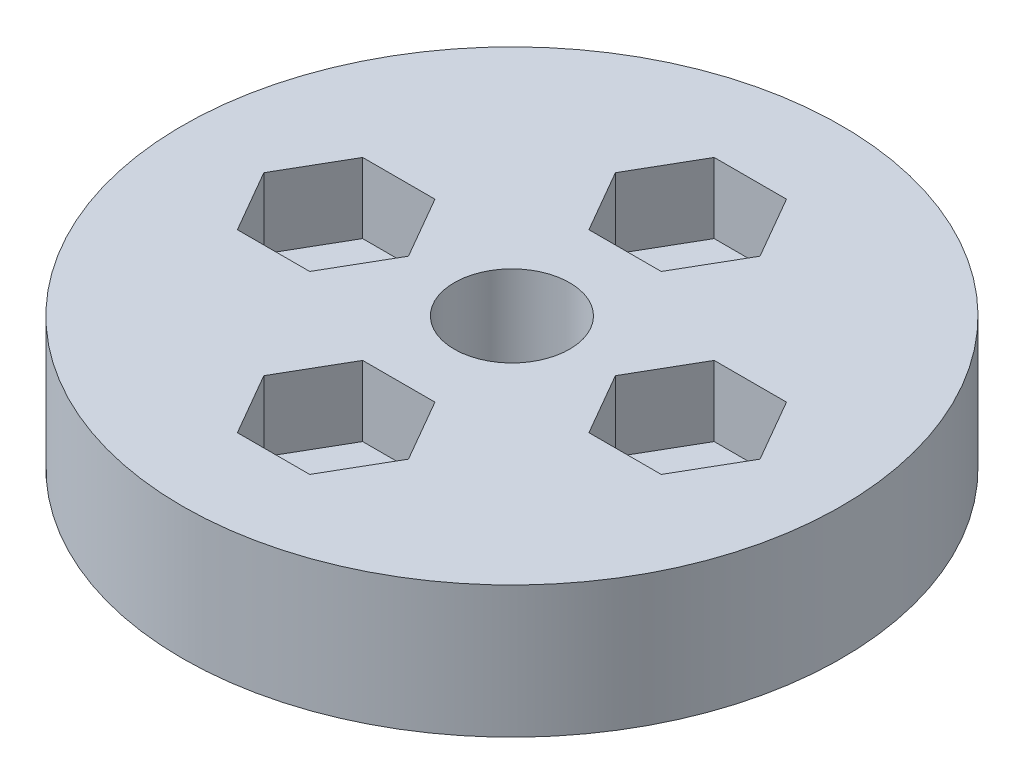
ISO-10303-21;
HEADER;
FILE_DESCRIPTION(('STEP AP214'),'2;1');
FILE_NAME('part.step','',(''),(''),'','','');
FILE_SCHEMA(('AUTOMOTIVE_DESIGN { 1 0 10303 214 1 1 1 1 }'));
ENDSEC;
DATA;
#1=APPLICATION_CONTEXT('core data for automotive mechanical design processes');
#2=APPLICATION_PROTOCOL_DEFINITION('international standard','automotive_design',2000,#1);
#3=PRODUCT_CONTEXT('',#1,'mechanical');
#4=PRODUCT('Part','Part','',(#3));
#5=PRODUCT_RELATED_PRODUCT_CATEGORY('part','',(#4));
#6=PRODUCT_DEFINITION_FORMATION('','',#4);
#7=PRODUCT_DEFINITION_CONTEXT('part definition',#1,'design');
#8=PRODUCT_DEFINITION('design','',#6,#7);
#9=PRODUCT_DEFINITION_SHAPE('','',#8);
#10=(LENGTH_UNIT() NAMED_UNIT(*) SI_UNIT(.MILLI.,.METRE.));
#11=(NAMED_UNIT(*) PLANE_ANGLE_UNIT() SI_UNIT($,.RADIAN.));
#12=(NAMED_UNIT(*) SI_UNIT($,.STERADIAN.) SOLID_ANGLE_UNIT());
#13=UNCERTAINTY_MEASURE_WITH_UNIT(LENGTH_MEASURE(1.E-05),#10,'distance_accuracy_value','');
#14=(GEOMETRIC_REPRESENTATION_CONTEXT(3) GLOBAL_UNCERTAINTY_ASSIGNED_CONTEXT((#13)) GLOBAL_UNIT_ASSIGNED_CONTEXT((#10,
#11,#12)) REPRESENTATION_CONTEXT('',''));
#15=CARTESIAN_POINT('',(0.,0.,0.));
#16=DIRECTION('',(0.,0.,1.));
#17=DIRECTION('',(1.,0.,0.));
#18=AXIS2_PLACEMENT_3D('',#15,#16,#17);
#19=CARTESIAN_POINT('',(0.,6.,-8.));
#20=DIRECTION('',(0.,-1.,0.));
#21=DIRECTION('',(0.,0.,-1.));
#22=AXIS2_PLACEMENT_3D('',#19,#20,#21);
#23=CYLINDRICAL_SURFACE('',#22,1.5);
#24=CARTESIAN_POINT('',(0.,0.,-8.));
#25=DIRECTION('',(0.,1.,0.));
#26=DIRECTION('',(0.,0.,1.));
#27=AXIS2_PLACEMENT_3D('',#24,#25,#26);
#28=CIRCLE('',#27,1.5);
#29=CARTESIAN_POINT('',(0.,0.,-6.5));
#30=VERTEX_POINT('',#29);
#31=EDGE_CURVE('E491',#30,#30,#28,.T.);
#32=ORIENTED_EDGE('',*,*,#31,.F.);
#33=EDGE_LOOP('',(#32));
#34=FACE_BOUND('',#33,.T.);
#35=CARTESIAN_POINT('',(0.,2.8,-8.));
#36=DIRECTION('',(0.,1.,0.));
#37=DIRECTION('',(0.,0.,1.));
#38=AXIS2_PLACEMENT_3D('',#35,#36,#37);
#39=CIRCLE('',#38,1.5);
#40=CARTESIAN_POINT('',(0.,2.8,-6.5));
#41=VERTEX_POINT('',#40);
#42=EDGE_CURVE('E42',#41,#41,#39,.T.);
#43=ORIENTED_EDGE('',*,*,#42,.T.);
#44=EDGE_LOOP('',(#43));
#45=FACE_BOUND('',#44,.T.);
#46=ADVANCED_FACE('F38',(#34,#45),#23,.F.);
#47=CARTESIAN_POINT('',(8.00000000000023,6.,-2.25904099284255E-13));
#48=DIRECTION('',(0.,-1.,0.));
#49=DIRECTION('',(0.,0.,-1.));
#50=AXIS2_PLACEMENT_3D('',#47,#48,#49);
#51=CYLINDRICAL_SURFACE('',#50,1.50000000000018);
#52=CARTESIAN_POINT('',(8.00000000000023,0.,-2.25904099284255E-13));
#53=DIRECTION('',(0.,1.,0.));
#54=DIRECTION('',(0.,0.,1.));
#55=AXIS2_PLACEMENT_3D('',#52,#53,#54);
#56=CIRCLE('',#55,1.50000000000018);
#57=CARTESIAN_POINT('',(8.00000000000023,0.,1.49999999999995));
#58=VERTEX_POINT('',#57);
#59=EDGE_CURVE('E487',#58,#58,#56,.T.);
#60=ORIENTED_EDGE('',*,*,#59,.F.);
#61=EDGE_LOOP('',(#60));
#62=FACE_BOUND('',#61,.T.);
#63=CARTESIAN_POINT('',(8.00000000000023,2.8,-2.25904099284255E-13));
#64=DIRECTION('',(0.,1.,0.));
#65=DIRECTION('',(0.,0.,1.));
#66=AXIS2_PLACEMENT_3D('',#63,#64,#65);
#67=CIRCLE('',#66,1.50000000000018);
#68=CARTESIAN_POINT('',(8.00000000000023,2.8,1.49999999999995));
#69=VERTEX_POINT('',#68);
#70=EDGE_CURVE('E504',#69,#69,#67,.T.);
#71=ORIENTED_EDGE('',*,*,#70,.T.);
#72=EDGE_LOOP('',(#71));
#73=FACE_BOUND('',#72,.T.);
#74=ADVANCED_FACE('F523',(#62,#73),#51,.F.);
#75=CARTESIAN_POINT('',(0.,6.,8.));
#76=DIRECTION('',(0.,-1.,0.));
#77=DIRECTION('',(0.,0.,-1.));
#78=AXIS2_PLACEMENT_3D('',#75,#76,#77);
#79=CYLINDRICAL_SURFACE('',#78,1.50000000000005);
#80=CARTESIAN_POINT('',(0.,0.,8.));
#81=DIRECTION('',(0.,1.,0.));
#82=DIRECTION('',(0.,0.,1.));
#83=AXIS2_PLACEMENT_3D('',#80,#81,#82);
#84=CIRCLE('',#83,1.50000000000005);
#85=CARTESIAN_POINT('',(0.,0.,9.50000000000006));
#86=VERTEX_POINT('',#85);
#87=EDGE_CURVE('E483',#86,#86,#84,.T.);
#88=ORIENTED_EDGE('',*,*,#87,.F.);
#89=EDGE_LOOP('',(#88));
#90=FACE_BOUND('',#89,.T.);
#91=CARTESIAN_POINT('',(0.,2.8,8.));
#92=DIRECTION('',(0.,1.,0.));
#93=DIRECTION('',(0.,0.,1.));
#94=AXIS2_PLACEMENT_3D('',#91,#92,#93);
#95=CIRCLE('',#94,1.50000000000005);
#96=CARTESIAN_POINT('',(0.,2.8,9.50000000000006));
#97=VERTEX_POINT('',#96);
#98=EDGE_CURVE('E501',#97,#97,#95,.T.);
#99=ORIENTED_EDGE('',*,*,#98,.T.);
#100=EDGE_LOOP('',(#99));
#101=FACE_BOUND('',#100,.T.);
#102=ADVANCED_FACE('F530',(#90,#101),#79,.F.);
#103=CARTESIAN_POINT('',(-7.99999999999977,6.,2.26883816723573E-13));
#104=DIRECTION('',(0.,-1.,0.));
#105=DIRECTION('',(0.,0.,-1.));
#106=AXIS2_PLACEMENT_3D('',#103,#104,#105);
#107=CYLINDRICAL_SURFACE('',#106,1.50000000000036);
#108=CARTESIAN_POINT('',(-7.99999999999977,0.,2.26883816723573E-13));
#109=DIRECTION('',(0.,1.,0.));
#110=DIRECTION('',(0.,0.,1.));
#111=AXIS2_PLACEMENT_3D('',#108,#109,#110);
#112=CIRCLE('',#111,1.50000000000036);
#113=CARTESIAN_POINT('',(-7.99999999999977,0.,1.50000000000059));
#114=VERTEX_POINT('',#113);
#115=EDGE_CURVE('E475',#114,#114,#112,.T.);
#116=ORIENTED_EDGE('',*,*,#115,.F.);
#117=EDGE_LOOP('',(#116));
#118=FACE_BOUND('',#117,.T.);
#119=CARTESIAN_POINT('',(-7.99999999999977,2.8,2.26883816723573E-13));
#120=DIRECTION('',(0.,1.,0.));
#121=DIRECTION('',(0.,0.,1.));
#122=AXIS2_PLACEMENT_3D('',#119,#120,#121);
#123=CIRCLE('',#122,1.50000000000036);
#124=CARTESIAN_POINT('',(-7.99999999999977,2.8,1.50000000000059));
#125=VERTEX_POINT('',#124);
#126=EDGE_CURVE('E264',#125,#125,#123,.T.);
#127=ORIENTED_EDGE('',*,*,#126,.T.);
#128=EDGE_LOOP('',(#127));
#129=FACE_BOUND('',#128,.T.);
#130=ADVANCED_FACE('F539',(#118,#129),#107,.F.);
#131=CARTESIAN_POINT('',(0.,6.,0.));
#132=DIRECTION('',(0.,1.,0.));
#133=DIRECTION('',(0.,0.,1.));
#134=AXIS2_PLACEMENT_3D('',#131,#132,#133);
#135=PLANE('',#134);
#136=DIRECTION('',(0.5,0.,-0.866025403784439));
#137=VECTOR('',#136,1.);
#138=CARTESIAN_POINT('',(1.64544826719043,6.,-5.15));
#139=LINE('',#138,#137);
#140=CARTESIAN_POINT('',(1.64544826719043,6.,-5.15));
#141=VERTEX_POINT('',#140);
#142=CARTESIAN_POINT('',(3.29089653438087,6.,-8.));
#143=VERTEX_POINT('',#142);
#144=EDGE_CURVE('E56',#141,#143,#139,.T.);
#145=ORIENTED_EDGE('',*,*,#144,.F.);
#146=DIRECTION('',(1.,0.,0.));
#147=VECTOR('',#146,1.);
#148=CARTESIAN_POINT('',(-1.64544826719043,6.,-5.15));
#149=LINE('',#148,#147);
#150=CARTESIAN_POINT('',(-1.64544826719043,6.,-5.15));
#151=VERTEX_POINT('',#150);
#152=EDGE_CURVE('E226',#151,#141,#149,.T.);
#153=ORIENTED_EDGE('',*,*,#152,.F.);
#154=DIRECTION('',(0.5,0.,0.866025403784439));
#155=VECTOR('',#154,1.);
#156=CARTESIAN_POINT('',(-3.29089653438087,6.,-8.));
#157=LINE('',#156,#155);
#158=CARTESIAN_POINT('',(-3.29089653438087,6.,-8.));
#159=VERTEX_POINT('',#158);
#160=EDGE_CURVE('E230',#159,#151,#157,.T.);
#161=ORIENTED_EDGE('',*,*,#160,.F.);
#162=DIRECTION('',(-0.5,0.,0.866025403784439));
#163=VECTOR('',#162,1.);
#164=CARTESIAN_POINT('',(-1.64544826719043,6.,-10.85));
#165=LINE('',#164,#163);
#166=CARTESIAN_POINT('',(-1.64544826719043,6.,-10.85));
#167=VERTEX_POINT('',#166);
#168=EDGE_CURVE('E254',#167,#159,#165,.T.);
#169=ORIENTED_EDGE('',*,*,#168,.F.);
#170=DIRECTION('',(-1.,0.,0.));
#171=VECTOR('',#170,1.);
#172=CARTESIAN_POINT('',(1.64544826719044,6.,-10.85));
#173=LINE('',#172,#171);
#174=CARTESIAN_POINT('',(1.64544826719044,6.,-10.85));
#175=VERTEX_POINT('',#174);
#176=EDGE_CURVE('E250',#175,#167,#173,.T.);
#177=ORIENTED_EDGE('',*,*,#176,.F.);
#178=DIRECTION('',(-0.5,0.,-0.866025403784439));
#179=VECTOR('',#178,1.);
#180=CARTESIAN_POINT('',(3.29089653438087,6.,-8.));
#181=LINE('',#180,#179);
#182=EDGE_CURVE('E246',#143,#175,#181,.T.);
#183=ORIENTED_EDGE('',*,*,#182,.F.);
#184=EDGE_LOOP('',(#145,#153,#161,#169,#177,#183));
#185=FACE_BOUND('',#184,.T.);
#186=DIRECTION('',(0.5,0.,-0.866025403784439));
#187=VECTOR('',#186,1.);
#188=CARTESIAN_POINT('',(9.64544826719066,6.,2.85000000000022));
#189=LINE('',#188,#187);
#190=CARTESIAN_POINT('',(9.64544826719066,6.,2.85000000000022));
#191=VERTEX_POINT('',#190);
#192=CARTESIAN_POINT('',(11.2908965343811,6.,2.27248775352962E-13));
#193=VERTEX_POINT('',#192);
#194=EDGE_CURVE('E64',#191,#193,#189,.T.);
#195=ORIENTED_EDGE('',*,*,#194,.F.);
#196=DIRECTION('',(1.,0.,0.));
#197=VECTOR('',#196,1.);
#198=CARTESIAN_POINT('',(6.35455173280979,6.,2.85000000000022));
#199=LINE('',#198,#197);
#200=CARTESIAN_POINT('',(6.35455173280979,6.,2.85000000000022));
#201=VERTEX_POINT('',#200);
#202=EDGE_CURVE('E281',#201,#191,#199,.T.);
#203=ORIENTED_EDGE('',*,*,#202,.F.);
#204=DIRECTION('',(0.5,0.,0.866025403784439));
#205=VECTOR('',#204,1.);
#206=CARTESIAN_POINT('',(4.70910346561936,6.,2.23993668594825E-13));
#207=LINE('',#206,#205);
#208=CARTESIAN_POINT('',(4.70910346561936,6.,2.23993668594825E-13));
#209=VERTEX_POINT('',#208);
#210=EDGE_CURVE('E317',#209,#201,#207,.T.);
#211=ORIENTED_EDGE('',*,*,#210,.F.);
#212=DIRECTION('',(-0.5,0.,0.866025403784439));
#213=VECTOR('',#212,1.);
#214=CARTESIAN_POINT('',(6.35455173280979,6.,-2.84999999999977));
#215=LINE('',#214,#213);
#216=CARTESIAN_POINT('',(6.35455173280979,6.,-2.84999999999977));
#217=VERTEX_POINT('',#216);
#218=EDGE_CURVE('E313',#217,#209,#215,.T.);
#219=ORIENTED_EDGE('',*,*,#218,.F.);
#220=DIRECTION('',(-1.,0.,0.));
#221=VECTOR('',#220,1.);
#222=CARTESIAN_POINT('',(9.64544826719066,6.,-2.84999999999977));
#223=LINE('',#222,#221);
#224=CARTESIAN_POINT('',(9.64544826719066,6.,-2.84999999999977));
#225=VERTEX_POINT('',#224);
#226=EDGE_CURVE('E309',#225,#217,#223,.T.);
#227=ORIENTED_EDGE('',*,*,#226,.F.);
#228=DIRECTION('',(-0.5,0.,-0.866025403784439));
#229=VECTOR('',#228,1.);
#230=CARTESIAN_POINT('',(11.2908965343811,6.,2.26815094483968E-13));
#231=LINE('',#230,#229);
#232=EDGE_CURVE('E304',#193,#225,#231,.T.);
#233=ORIENTED_EDGE('',*,*,#232,.F.);
#234=EDGE_LOOP('',(#195,#203,#211,#219,#227,#233));
#235=FACE_BOUND('',#234,.T.);
#236=DIRECTION('',(0.5,0.,-0.866025403784439));
#237=VECTOR('',#236,1.);
#238=CARTESIAN_POINT('',(-6.35455173280934,6.,2.85000000000023));
#239=LINE('',#238,#237);
#240=CARTESIAN_POINT('',(-6.35455173280934,6.,2.85000000000023));
#241=VERTEX_POINT('',#240);
#242=CARTESIAN_POINT('',(-4.70910346561891,6.,2.26815094483968E-13));
#243=VERTEX_POINT('',#242);
#244=EDGE_CURVE('E366',#241,#243,#239,.T.);
#245=ORIENTED_EDGE('',*,*,#244,.F.);
#246=DIRECTION('',(1.,0.,0.));
#247=VECTOR('',#246,1.);
#248=CARTESIAN_POINT('',(-9.64544826719021,6.,2.85000000000023));
#249=LINE('',#248,#247);
#250=CARTESIAN_POINT('',(-9.64544826719021,6.,2.85000000000023));
#251=VERTEX_POINT('',#250);
#252=EDGE_CURVE('E345',#251,#241,#249,.T.);
#253=ORIENTED_EDGE('',*,*,#252,.F.);
#254=DIRECTION('',(0.5,0.,0.866025403784438));
#255=VECTOR('',#254,1.);
#256=CARTESIAN_POINT('',(-11.2908965343806,6.,2.26364736865402E-13));
#257=LINE('',#256,#255);
#258=CARTESIAN_POINT('',(-11.2908965343806,6.,2.26364736865402E-13));
#259=VERTEX_POINT('',#258);
#260=EDGE_CURVE('E382',#259,#251,#257,.T.);
#261=ORIENTED_EDGE('',*,*,#260,.F.);
#262=DIRECTION('',(-0.5,0.,0.866025403784439));
#263=VECTOR('',#262,1.);
#264=CARTESIAN_POINT('',(-9.64544826719021,6.,-2.84999999999977));
#265=LINE('',#264,#263);
#266=CARTESIAN_POINT('',(-9.64544826719021,6.,-2.84999999999977));
#267=VERTEX_POINT('',#266);
#268=EDGE_CURVE('E378',#267,#259,#265,.T.);
#269=ORIENTED_EDGE('',*,*,#268,.F.);
#270=DIRECTION('',(-1.,0.,0.));
#271=VECTOR('',#270,1.);
#272=CARTESIAN_POINT('',(-6.35455173280934,6.,-2.84999999999977));
#273=LINE('',#272,#271);
#274=CARTESIAN_POINT('',(-6.35455173280934,6.,-2.84999999999977));
#275=VERTEX_POINT('',#274);
#276=EDGE_CURVE('E374',#275,#267,#273,.T.);
#277=ORIENTED_EDGE('',*,*,#276,.F.);
#278=DIRECTION('',(-0.5,0.,-0.866025403784438));
#279=VECTOR('',#278,1.);
#280=CARTESIAN_POINT('',(-4.70910346561891,6.,2.26783581981352E-13));
#281=LINE('',#280,#279);
#282=EDGE_CURVE('E369',#243,#275,#281,.T.);
#283=ORIENTED_EDGE('',*,*,#282,.F.);
#284=EDGE_LOOP('',(#245,#253,#261,#269,#277,#283));
#285=FACE_BOUND('',#284,.T.);
#286=DIRECTION('',(0.5,0.,-0.866025403784438));
#287=VECTOR('',#286,1.);
#288=CARTESIAN_POINT('',(1.64544826719043,6.,10.85));
#289=LINE('',#288,#287);
#290=CARTESIAN_POINT('',(1.64544826719043,6.,10.85));
#291=VERTEX_POINT('',#290);
#292=CARTESIAN_POINT('',(3.29089653438087,6.,8.));
#293=VERTEX_POINT('',#292);
#294=EDGE_CURVE('E432',#291,#293,#289,.T.);
#295=ORIENTED_EDGE('',*,*,#294,.F.);
#296=DIRECTION('',(1.,0.,0.));
#297=VECTOR('',#296,1.);
#298=CARTESIAN_POINT('',(-1.64544826719043,6.,10.85));
#299=LINE('',#298,#297);
#300=CARTESIAN_POINT('',(-1.64544826719043,6.,10.85));
#301=VERTEX_POINT('',#300);
#302=EDGE_CURVE('E411',#301,#291,#299,.T.);
#303=ORIENTED_EDGE('',*,*,#302,.F.);
#304=DIRECTION('',(0.5,0.,0.866025403784438));
#305=VECTOR('',#304,1.);
#306=CARTESIAN_POINT('',(-3.29089653438087,6.,8.));
#307=LINE('',#306,#305);
#308=CARTESIAN_POINT('',(-3.29089653438087,6.,8.));
#309=VERTEX_POINT('',#308);
#310=EDGE_CURVE('E447',#309,#301,#307,.T.);
#311=ORIENTED_EDGE('',*,*,#310,.F.);
#312=DIRECTION('',(-0.5,0.,0.866025403784438));
#313=VECTOR('',#312,1.);
#314=CARTESIAN_POINT('',(-1.64544826719043,6.,5.15));
#315=LINE('',#314,#313);
#316=CARTESIAN_POINT('',(-1.64544826719043,6.,5.15));
#317=VERTEX_POINT('',#316);
#318=EDGE_CURVE('E443',#317,#309,#315,.T.);
#319=ORIENTED_EDGE('',*,*,#318,.F.);
#320=DIRECTION('',(-1.,0.,0.));
#321=VECTOR('',#320,1.);
#322=CARTESIAN_POINT('',(1.64544826719043,6.,5.15));
#323=LINE('',#322,#321);
#324=CARTESIAN_POINT('',(1.64544826719043,6.,5.15));
#325=VERTEX_POINT('',#324);
#326=EDGE_CURVE('E439',#325,#317,#323,.T.);
#327=ORIENTED_EDGE('',*,*,#326,.F.);
#328=DIRECTION('',(-0.500000000000001,0.,-0.866025403784438));
#329=VECTOR('',#328,1.);
#330=CARTESIAN_POINT('',(3.29089653438087,6.,8.));
#331=LINE('',#330,#329);
#332=EDGE_CURVE('E435',#293,#325,#331,.T.);
#333=ORIENTED_EDGE('',*,*,#332,.F.);
#334=EDGE_LOOP('',(#295,#303,#311,#319,#327,#333));
#335=FACE_BOUND('',#334,.T.);
#336=CARTESIAN_POINT('',(0.,6.,0.));
#337=DIRECTION('',(0.,1.,0.));
#338=DIRECTION('',(0.,0.,1.));
#339=AXIS2_PLACEMENT_3D('',#336,#337,#338);
#340=CIRCLE('',#339,15.);
#341=CARTESIAN_POINT('',(0.,6.,15.));
#342=VERTEX_POINT('',#341);
#343=EDGE_CURVE('E11',#342,#342,#340,.T.);
#344=ORIENTED_EDGE('',*,*,#343,.T.);
#345=EDGE_LOOP('',(#344));
#346=FACE_BOUND('',#345,.T.);
#347=CARTESIAN_POINT('',(0.,6.,0.));
#348=DIRECTION('',(0.,1.,0.));
#349=DIRECTION('',(0.,0.,1.));
#350=AXIS2_PLACEMENT_3D('',#347,#348,#349);
#351=CIRCLE('',#350,2.625);
#352=CARTESIAN_POINT('',(0.,6.,2.625));
#353=VERTEX_POINT('',#352);
#354=EDGE_CURVE('E471',#353,#353,#351,.T.);
#355=ORIENTED_EDGE('',*,*,#354,.F.);
#356=EDGE_LOOP('',(#355));
#357=FACE_BOUND('',#356,.T.);
#358=ADVANCED_FACE('F536',(#185,#235,#285,#335,#346,#357),#135,.T.);
#359=CARTESIAN_POINT('',(0.,0.,0.));
#360=DIRECTION('',(0.,1.,0.));
#361=DIRECTION('',(0.,0.,1.));
#362=AXIS2_PLACEMENT_3D('',#359,#360,#361);
#363=PLANE('',#362);
#364=CARTESIAN_POINT('',(0.,0.,0.));
#365=DIRECTION('',(0.,1.,0.));
#366=DIRECTION('',(0.,0.,1.));
#367=AXIS2_PLACEMENT_3D('',#364,#365,#366);
#368=CIRCLE('',#367,15.);
#369=CARTESIAN_POINT('',(0.,0.,15.));
#370=VERTEX_POINT('',#369);
#371=EDGE_CURVE('E48',#370,#370,#368,.T.);
#372=ORIENTED_EDGE('',*,*,#371,.F.);
#373=EDGE_LOOP('',(#372));
#374=FACE_BOUND('',#373,.T.);
#375=ORIENTED_EDGE('',*,*,#31,.T.);
#376=EDGE_LOOP('',(#375));
#377=FACE_BOUND('',#376,.T.);
#378=ORIENTED_EDGE('',*,*,#59,.T.);
#379=EDGE_LOOP('',(#378));
#380=FACE_BOUND('',#379,.T.);
#381=ORIENTED_EDGE('',*,*,#87,.T.);
#382=EDGE_LOOP('',(#381));
#383=FACE_BOUND('',#382,.T.);
#384=ORIENTED_EDGE('',*,*,#115,.T.);
#385=EDGE_LOOP('',(#384));
#386=FACE_BOUND('',#385,.T.);
#387=CARTESIAN_POINT('',(0.,0.,0.));
#388=DIRECTION('',(0.,1.,0.));
#389=DIRECTION('',(0.,0.,1.));
#390=AXIS2_PLACEMENT_3D('',#387,#388,#389);
#391=CIRCLE('',#390,2.625);
#392=CARTESIAN_POINT('',(0.,0.,2.625));
#393=VERTEX_POINT('',#392);
#394=EDGE_CURVE('E476',#393,#393,#391,.T.);
#395=ORIENTED_EDGE('',*,*,#394,.T.);
#396=EDGE_LOOP('',(#395));
#397=FACE_BOUND('',#396,.T.);
#398=ADVANCED_FACE('F538',(#374,#377,#380,#383,#386,#397),#363,.F.);
#399=CARTESIAN_POINT('',(0.,6.,0.));
#400=DIRECTION('',(0.,-1.,0.));
#401=DIRECTION('',(0.,0.,-1.));
#402=AXIS2_PLACEMENT_3D('',#399,#400,#401);
#403=CYLINDRICAL_SURFACE('',#402,15.);
#404=ORIENTED_EDGE('',*,*,#343,.F.);
#405=EDGE_LOOP('',(#404));
#406=FACE_BOUND('',#405,.T.);
#407=ORIENTED_EDGE('',*,*,#371,.T.);
#408=EDGE_LOOP('',(#407));
#409=FACE_BOUND('',#408,.T.);
#410=ADVANCED_FACE('F40',(#406,#409),#403,.T.);
#411=CARTESIAN_POINT('',(0.,6.,0.));
#412=DIRECTION('',(0.,-1.,0.));
#413=DIRECTION('',(0.,0.,-1.));
#414=AXIS2_PLACEMENT_3D('',#411,#412,#413);
#415=CYLINDRICAL_SURFACE('',#414,2.625);
#416=ORIENTED_EDGE('',*,*,#354,.T.);
#417=EDGE_LOOP('',(#416));
#418=FACE_BOUND('',#417,.T.);
#419=ORIENTED_EDGE('',*,*,#394,.F.);
#420=EDGE_LOOP('',(#419));
#421=FACE_BOUND('',#420,.T.);
#422=ADVANCED_FACE('F547',(#418,#421),#415,.F.);
#423=CARTESIAN_POINT('',(-6.35455173280934,2.8,2.85000000000023));
#424=DIRECTION('',(0.866025403784439,0.,0.5));
#425=DIRECTION('',(0.5,0.,-0.866025403784439));
#426=AXIS2_PLACEMENT_3D('',#423,#424,#425);
#427=PLANE('',#426);
#428=ORIENTED_EDGE('',*,*,#244,.T.);
#429=DIRECTION('',(0.,1.,0.));
#430=VECTOR('',#429,1.);
#431=CARTESIAN_POINT('',(-4.70910346561891,2.8,2.26783581981352E-13));
#432=LINE('',#431,#430);
#433=CARTESIAN_POINT('',(-4.70910346561891,2.8,2.26783581981352E-13));
#434=VERTEX_POINT('',#433);
#435=EDGE_CURVE('E365',#434,#243,#432,.T.);
#436=ORIENTED_EDGE('',*,*,#435,.F.);
#437=DIRECTION('',(0.5,0.,-0.866025403784439));
#438=VECTOR('',#437,1.);
#439=CARTESIAN_POINT('',(-6.35455173280934,2.8,2.85000000000023));
#440=LINE('',#439,#438);
#441=CARTESIAN_POINT('',(-6.35455173280934,2.8,2.85000000000023));
#442=VERTEX_POINT('',#441);
#443=EDGE_CURVE('E340',#442,#434,#440,.T.);
#444=ORIENTED_EDGE('',*,*,#443,.F.);
#445=DIRECTION('',(0.,1.,0.));
#446=VECTOR('',#445,1.);
#447=CARTESIAN_POINT('',(-6.35455173280934,2.8,2.85000000000023));
#448=LINE('',#447,#446);
#449=EDGE_CURVE('E305',#442,#241,#448,.T.);
#450=ORIENTED_EDGE('',*,*,#449,.T.);
#451=EDGE_LOOP('',(#428,#436,#444,#450));
#452=FACE_BOUND('',#451,.T.);
#453=ADVANCED_FACE('F561',(#452),#427,.F.);
#454=CARTESIAN_POINT('',(-9.64544826719021,2.8,2.85000000000023));
#455=DIRECTION('',(0.,0.,1.));
#456=DIRECTION('',(1.,0.,0.));
#457=AXIS2_PLACEMENT_3D('',#454,#455,#456);
#458=PLANE('',#457);
#459=ORIENTED_EDGE('',*,*,#252,.T.);
#460=ORIENTED_EDGE('',*,*,#449,.F.);
#461=DIRECTION('',(1.,0.,0.));
#462=VECTOR('',#461,1.);
#463=CARTESIAN_POINT('',(-9.64544826719021,2.8,2.85000000000023));
#464=LINE('',#463,#462);
#465=CARTESIAN_POINT('',(-9.64544826719021,2.8,2.85000000000023));
#466=VERTEX_POINT('',#465);
#467=EDGE_CURVE('E361',#466,#442,#464,.T.);
#468=ORIENTED_EDGE('',*,*,#467,.F.);
#469=DIRECTION('',(0.,1.,0.));
#470=VECTOR('',#469,1.);
#471=CARTESIAN_POINT('',(-9.64544826719021,2.8,2.85000000000023));
#472=LINE('',#471,#470);
#473=EDGE_CURVE('E391',#466,#251,#472,.T.);
#474=ORIENTED_EDGE('',*,*,#473,.T.);
#475=EDGE_LOOP('',(#459,#460,#468,#474));
#476=FACE_BOUND('',#475,.T.);
#477=ADVANCED_FACE('F567',(#476),#458,.F.);
#478=CARTESIAN_POINT('',(-11.2908965343806,2.8,2.26364736865402E-13));
#479=DIRECTION('',(-0.866025403784438,0.,0.5));
#480=DIRECTION('',(0.5,0.,0.866025403784438));
#481=AXIS2_PLACEMENT_3D('',#478,#479,#480);
#482=PLANE('',#481);
#483=ORIENTED_EDGE('',*,*,#260,.T.);
#484=ORIENTED_EDGE('',*,*,#473,.F.);
#485=DIRECTION('',(0.5,0.,0.866025403784438));
#486=VECTOR('',#485,1.);
#487=CARTESIAN_POINT('',(-11.2908965343806,2.8,2.26364736865402E-13));
#488=LINE('',#487,#486);
#489=CARTESIAN_POINT('',(-11.2908965343806,2.8,2.26364736865402E-13));
#490=VERTEX_POINT('',#489);
#491=EDGE_CURVE('E357',#490,#466,#488,.T.);
#492=ORIENTED_EDGE('',*,*,#491,.F.);
#493=DIRECTION('',(0.,1.,0.));
#494=VECTOR('',#493,1.);
#495=CARTESIAN_POINT('',(-11.2908965343806,2.8,2.26364736865402E-13));
#496=LINE('',#495,#494);
#497=EDGE_CURVE('E394',#490,#259,#496,.T.);
#498=ORIENTED_EDGE('',*,*,#497,.T.);
#499=EDGE_LOOP('',(#483,#484,#492,#498));
#500=FACE_BOUND('',#499,.T.);
#501=ADVANCED_FACE('F824',(#500),#482,.F.);
#502=CARTESIAN_POINT('',(-9.64544826719021,2.8,-2.84999999999977));
#503=DIRECTION('',(-0.866025403784439,0.,-0.5));
#504=DIRECTION('',(-0.5,0.,0.866025403784439));
#505=AXIS2_PLACEMENT_3D('',#502,#503,#504);
#506=PLANE('',#505);
#507=ORIENTED_EDGE('',*,*,#268,.T.);
#508=ORIENTED_EDGE('',*,*,#497,.F.);
#509=DIRECTION('',(-0.5,0.,0.866025403784439));
#510=VECTOR('',#509,1.);
#511=CARTESIAN_POINT('',(-9.64544826719021,2.8,-2.84999999999977));
#512=LINE('',#511,#510);
#513=CARTESIAN_POINT('',(-9.64544826719021,2.8,-2.84999999999977));
#514=VERTEX_POINT('',#513);
#515=EDGE_CURVE('E353',#514,#490,#512,.T.);
#516=ORIENTED_EDGE('',*,*,#515,.F.);
#517=DIRECTION('',(0.,1.,0.));
#518=VECTOR('',#517,1.);
#519=CARTESIAN_POINT('',(-9.64544826719021,2.8,-2.84999999999977));
#520=LINE('',#519,#518);
#521=EDGE_CURVE('E397',#514,#267,#520,.T.);
#522=ORIENTED_EDGE('',*,*,#521,.T.);
#523=EDGE_LOOP('',(#507,#508,#516,#522));
#524=FACE_BOUND('',#523,.T.);
#525=ADVANCED_FACE('F815',(#524),#506,.F.);
#526=CARTESIAN_POINT('',(-6.35455173280934,2.8,-2.84999999999977));
#527=DIRECTION('',(0.,0.,-1.));
#528=DIRECTION('',(-1.,0.,0.));
#529=AXIS2_PLACEMENT_3D('',#526,#527,#528);
#530=PLANE('',#529);
#531=ORIENTED_EDGE('',*,*,#276,.T.);
#532=ORIENTED_EDGE('',*,*,#521,.F.);
#533=DIRECTION('',(-1.,0.,0.));
#534=VECTOR('',#533,1.);
#535=CARTESIAN_POINT('',(-6.35455173280934,2.8,-2.84999999999977));
#536=LINE('',#535,#534);
#537=CARTESIAN_POINT('',(-6.35455173280934,2.8,-2.84999999999977));
#538=VERTEX_POINT('',#537);
#539=EDGE_CURVE('E349',#538,#514,#536,.T.);
#540=ORIENTED_EDGE('',*,*,#539,.F.);
#541=DIRECTION('',(0.,1.,0.));
#542=VECTOR('',#541,1.);
#543=CARTESIAN_POINT('',(-6.35455173280934,2.8,-2.84999999999977));
#544=LINE('',#543,#542);
#545=EDGE_CURVE('E400',#538,#275,#544,.T.);
#546=ORIENTED_EDGE('',*,*,#545,.T.);
#547=EDGE_LOOP('',(#531,#532,#540,#546));
#548=FACE_BOUND('',#547,.T.);
#549=ADVANCED_FACE('F806',(#548),#530,.F.);
#550=CARTESIAN_POINT('',(-4.70910346561891,2.8,2.26783581981352E-13));
#551=DIRECTION('',(0.866025403784438,0.,-0.5));
#552=DIRECTION('',(-0.5,0.,-0.866025403784439));
#553=AXIS2_PLACEMENT_3D('',#550,#551,#552);
#554=PLANE('',#553);
#555=ORIENTED_EDGE('',*,*,#282,.T.);
#556=ORIENTED_EDGE('',*,*,#545,.F.);
#557=DIRECTION('',(-0.5,0.,-0.866025403784438));
#558=VECTOR('',#557,1.);
#559=CARTESIAN_POINT('',(-4.70910346561891,2.8,2.26783581981352E-13));
#560=LINE('',#559,#558);
#561=EDGE_CURVE('E344',#434,#538,#560,.T.);
#562=ORIENTED_EDGE('',*,*,#561,.F.);
#563=ORIENTED_EDGE('',*,*,#435,.T.);
#564=EDGE_LOOP('',(#555,#556,#562,#563));
#565=FACE_BOUND('',#564,.T.);
#566=ADVANCED_FACE('F797',(#565),#554,.F.);
#567=CARTESIAN_POINT('',(0.,2.8,0.));
#568=DIRECTION('',(0.,1.,0.));
#569=DIRECTION('',(0.,0.,1.));
#570=AXIS2_PLACEMENT_3D('',#567,#568,#569);
#571=PLANE('',#570);
#572=ORIENTED_EDGE('',*,*,#126,.F.);
#573=EDGE_LOOP('',(#572));
#574=FACE_BOUND('',#573,.T.);
#575=ORIENTED_EDGE('',*,*,#443,.T.);
#576=ORIENTED_EDGE('',*,*,#561,.T.);
#577=ORIENTED_EDGE('',*,*,#539,.T.);
#578=ORIENTED_EDGE('',*,*,#515,.T.);
#579=ORIENTED_EDGE('',*,*,#491,.T.);
#580=ORIENTED_EDGE('',*,*,#467,.T.);
#581=EDGE_LOOP('',(#575,#576,#577,#578,#579,#580));
#582=FACE_BOUND('',#581,.T.);
#583=ADVANCED_FACE('F624',(#574,#582),#571,.T.);
#584=CARTESIAN_POINT('',(1.64544826719043,2.8,10.85));
#585=DIRECTION('',(0.866025403784438,0.,0.5));
#586=DIRECTION('',(0.5,0.,-0.866025403784439));
#587=AXIS2_PLACEMENT_3D('',#584,#585,#586);
#588=PLANE('',#587);
#589=ORIENTED_EDGE('',*,*,#294,.T.);
#590=DIRECTION('',(0.,1.,0.));
#591=VECTOR('',#590,1.);
#592=CARTESIAN_POINT('',(3.29089653438087,2.8,8.));
#593=LINE('',#592,#591);
#594=CARTESIAN_POINT('',(3.29089653438087,2.8,8.));
#595=VERTEX_POINT('',#594);
#596=EDGE_CURVE('E431',#595,#293,#593,.T.);
#597=ORIENTED_EDGE('',*,*,#596,.F.);
#598=DIRECTION('',(0.5,0.,-0.866025403784438));
#599=VECTOR('',#598,1.);
#600=CARTESIAN_POINT('',(1.64544826719043,2.8,10.85));
#601=LINE('',#600,#599);
#602=CARTESIAN_POINT('',(1.64544826719043,2.8,10.85));
#603=VERTEX_POINT('',#602);
#604=EDGE_CURVE('E406',#603,#595,#601,.T.);
#605=ORIENTED_EDGE('',*,*,#604,.F.);
#606=DIRECTION('',(0.,1.,0.));
#607=VECTOR('',#606,1.);
#608=CARTESIAN_POINT('',(1.64544826719043,2.8,10.85));
#609=LINE('',#608,#607);
#610=EDGE_CURVE('E370',#603,#291,#609,.T.);
#611=ORIENTED_EDGE('',*,*,#610,.T.);
#612=EDGE_LOOP('',(#589,#597,#605,#611));
#613=FACE_BOUND('',#612,.T.);
#614=ADVANCED_FACE('F572',(#613),#588,.F.);
#615=CARTESIAN_POINT('',(-1.64544826719043,2.8,10.85));
#616=DIRECTION('',(0.,0.,1.));
#617=DIRECTION('',(1.,0.,0.));
#618=AXIS2_PLACEMENT_3D('',#615,#616,#617);
#619=PLANE('',#618);
#620=ORIENTED_EDGE('',*,*,#302,.T.);
#621=ORIENTED_EDGE('',*,*,#610,.F.);
#622=DIRECTION('',(1.,0.,0.));
#623=VECTOR('',#622,1.);
#624=CARTESIAN_POINT('',(-1.64544826719043,2.8,10.85));
#625=LINE('',#624,#623);
#626=CARTESIAN_POINT('',(-1.64544826719043,2.8,10.85));
#627=VERTEX_POINT('',#626);
#628=EDGE_CURVE('E427',#627,#603,#625,.T.);
#629=ORIENTED_EDGE('',*,*,#628,.F.);
#630=DIRECTION('',(0.,1.,0.));
#631=VECTOR('',#630,1.);
#632=CARTESIAN_POINT('',(-1.64544826719043,2.8,10.85));
#633=LINE('',#632,#631);
#634=EDGE_CURVE('E456',#627,#301,#633,.T.);
#635=ORIENTED_EDGE('',*,*,#634,.T.);
#636=EDGE_LOOP('',(#620,#621,#629,#635));
#637=FACE_BOUND('',#636,.T.);
#638=ADVANCED_FACE('F610',(#637),#619,.F.);
#639=CARTESIAN_POINT('',(-3.29089653438087,2.8,8.));
#640=DIRECTION('',(-0.866025403784438,0.,0.5));
#641=DIRECTION('',(0.5,0.,0.866025403784439));
#642=AXIS2_PLACEMENT_3D('',#639,#640,#641);
#643=PLANE('',#642);
#644=ORIENTED_EDGE('',*,*,#310,.T.);
#645=ORIENTED_EDGE('',*,*,#634,.F.);
#646=DIRECTION('',(0.5,0.,0.866025403784438));
#647=VECTOR('',#646,1.);
#648=CARTESIAN_POINT('',(-3.29089653438087,2.8,8.));
#649=LINE('',#648,#647);
#650=CARTESIAN_POINT('',(-3.29089653438087,2.8,8.));
#651=VERTEX_POINT('',#650);
#652=EDGE_CURVE('E423',#651,#627,#649,.T.);
#653=ORIENTED_EDGE('',*,*,#652,.F.);
#654=DIRECTION('',(0.,1.,0.));
#655=VECTOR('',#654,1.);
#656=CARTESIAN_POINT('',(-3.29089653438087,2.8,8.));
#657=LINE('',#656,#655);
#658=EDGE_CURVE('E459',#651,#309,#657,.T.);
#659=ORIENTED_EDGE('',*,*,#658,.T.);
#660=EDGE_LOOP('',(#644,#645,#653,#659));
#661=FACE_BOUND('',#660,.T.);
#662=ADVANCED_FACE('F607',(#661),#643,.F.);
#663=CARTESIAN_POINT('',(-1.64544826719043,2.8,5.15));
#664=DIRECTION('',(-0.866025403784438,0.,-0.5));
#665=DIRECTION('',(-0.5,0.,0.866025403784439));
#666=AXIS2_PLACEMENT_3D('',#663,#664,#665);
#667=PLANE('',#666);
#668=ORIENTED_EDGE('',*,*,#318,.T.);
#669=ORIENTED_EDGE('',*,*,#658,.F.);
#670=DIRECTION('',(-0.5,0.,0.866025403784438));
#671=VECTOR('',#670,1.);
#672=CARTESIAN_POINT('',(-1.64544826719043,2.8,5.15));
#673=LINE('',#672,#671);
#674=CARTESIAN_POINT('',(-1.64544826719043,2.8,5.15));
#675=VERTEX_POINT('',#674);
#676=EDGE_CURVE('E419',#675,#651,#673,.T.);
#677=ORIENTED_EDGE('',*,*,#676,.F.);
#678=DIRECTION('',(0.,1.,0.));
#679=VECTOR('',#678,1.);
#680=CARTESIAN_POINT('',(-1.64544826719043,2.8,5.15));
#681=LINE('',#680,#679);
#682=EDGE_CURVE('E462',#675,#317,#681,.T.);
#683=ORIENTED_EDGE('',*,*,#682,.T.);
#684=EDGE_LOOP('',(#668,#669,#677,#683));
#685=FACE_BOUND('',#684,.T.);
#686=ADVANCED_FACE('F603',(#685),#667,.F.);
#687=CARTESIAN_POINT('',(1.64544826719043,2.8,5.15));
#688=DIRECTION('',(0.,0.,-1.));
#689=DIRECTION('',(-1.,0.,0.));
#690=AXIS2_PLACEMENT_3D('',#687,#688,#689);
#691=PLANE('',#690);
#692=ORIENTED_EDGE('',*,*,#326,.T.);
#693=ORIENTED_EDGE('',*,*,#682,.F.);
#694=DIRECTION('',(-1.,0.,0.));
#695=VECTOR('',#694,1.);
#696=CARTESIAN_POINT('',(1.64544826719043,2.8,5.15));
#697=LINE('',#696,#695);
#698=CARTESIAN_POINT('',(1.64544826719043,2.8,5.15));
#699=VERTEX_POINT('',#698);
#700=EDGE_CURVE('E415',#699,#675,#697,.T.);
#701=ORIENTED_EDGE('',*,*,#700,.F.);
#702=DIRECTION('',(0.,1.,0.));
#703=VECTOR('',#702,1.);
#704=CARTESIAN_POINT('',(1.64544826719043,2.8,5.15));
#705=LINE('',#704,#703);
#706=EDGE_CURVE('E465',#699,#325,#705,.T.);
#707=ORIENTED_EDGE('',*,*,#706,.T.);
#708=EDGE_LOOP('',(#692,#693,#701,#707));
#709=FACE_BOUND('',#708,.T.);
#710=ADVANCED_FACE('F599',(#709),#691,.F.);
#711=CARTESIAN_POINT('',(3.29089653438087,2.8,8.));
#712=DIRECTION('',(0.866025403784438,0.,-0.500000000000001));
#713=DIRECTION('',(-0.500000000000001,0.,-0.866025403784438));
#714=AXIS2_PLACEMENT_3D('',#711,#712,#713);
#715=PLANE('',#714);
#716=ORIENTED_EDGE('',*,*,#332,.T.);
#717=ORIENTED_EDGE('',*,*,#706,.F.);
#718=DIRECTION('',(-0.500000000000001,0.,-0.866025403784438));
#719=VECTOR('',#718,1.);
#720=CARTESIAN_POINT('',(3.29089653438087,2.8,8.));
#721=LINE('',#720,#719);
#722=EDGE_CURVE('E410',#595,#699,#721,.T.);
#723=ORIENTED_EDGE('',*,*,#722,.F.);
#724=ORIENTED_EDGE('',*,*,#596,.T.);
#725=EDGE_LOOP('',(#716,#717,#723,#724));
#726=FACE_BOUND('',#725,.T.);
#727=ADVANCED_FACE('F587',(#726),#715,.F.);
#728=CARTESIAN_POINT('',(0.,2.8,0.));
#729=DIRECTION('',(0.,1.,0.));
#730=DIRECTION('',(0.,0.,1.));
#731=AXIS2_PLACEMENT_3D('',#728,#729,#730);
#732=PLANE('',#731);
#733=ORIENTED_EDGE('',*,*,#98,.F.);
#734=EDGE_LOOP('',(#733));
#735=FACE_BOUND('',#734,.T.);
#736=ORIENTED_EDGE('',*,*,#604,.T.);
#737=ORIENTED_EDGE('',*,*,#722,.T.);
#738=ORIENTED_EDGE('',*,*,#700,.T.);
#739=ORIENTED_EDGE('',*,*,#676,.T.);
#740=ORIENTED_EDGE('',*,*,#652,.T.);
#741=ORIENTED_EDGE('',*,*,#628,.T.);
#742=EDGE_LOOP('',(#736,#737,#738,#739,#740,#741));
#743=FACE_BOUND('',#742,.T.);
#744=ADVANCED_FACE('F583',(#735,#743),#732,.T.);
#745=CARTESIAN_POINT('',(9.64544826719066,2.8,2.85000000000022));
#746=DIRECTION('',(0.866025403784439,0.,0.5));
#747=DIRECTION('',(0.5,0.,-0.866025403784439));
#748=AXIS2_PLACEMENT_3D('',#745,#746,#747);
#749=PLANE('',#748);
#750=ORIENTED_EDGE('',*,*,#194,.T.);
#751=DIRECTION('',(0.,1.,0.));
#752=VECTOR('',#751,1.);
#753=CARTESIAN_POINT('',(11.2908965343811,2.8,2.26815094483968E-13));
#754=LINE('',#753,#752);
#755=CARTESIAN_POINT('',(11.2908965343811,2.8,2.26815094483968E-13));
#756=VERTEX_POINT('',#755);
#757=EDGE_CURVE('E301',#756,#193,#754,.T.);
#758=ORIENTED_EDGE('',*,*,#757,.F.);
#759=DIRECTION('',(0.5,0.,-0.866025403784439));
#760=VECTOR('',#759,1.);
#761=CARTESIAN_POINT('',(9.64544826719066,2.8,2.85000000000022));
#762=LINE('',#761,#760);
#763=CARTESIAN_POINT('',(9.64544826719066,2.8,2.85000000000022));
#764=VERTEX_POINT('',#763);
#765=EDGE_CURVE('E276',#764,#756,#762,.T.);
#766=ORIENTED_EDGE('',*,*,#765,.F.);
#767=DIRECTION('',(0.,1.,0.));
#768=VECTOR('',#767,1.);
#769=CARTESIAN_POINT('',(9.64544826719066,2.8,2.85000000000022));
#770=LINE('',#769,#768);
#771=EDGE_CURVE('E247',#764,#191,#770,.T.);
#772=ORIENTED_EDGE('',*,*,#771,.T.);
#773=EDGE_LOOP('',(#750,#758,#766,#772));
#774=FACE_BOUND('',#773,.T.);
#775=ADVANCED_FACE('F586',(#774),#749,.F.);
#776=CARTESIAN_POINT('',(6.35455173280979,2.8,2.85000000000022));
#777=DIRECTION('',(0.,0.,1.));
#778=DIRECTION('',(1.,0.,0.));
#779=AXIS2_PLACEMENT_3D('',#776,#777,#778);
#780=PLANE('',#779);
#781=ORIENTED_EDGE('',*,*,#202,.T.);
#782=ORIENTED_EDGE('',*,*,#771,.F.);
#783=DIRECTION('',(1.,0.,0.));
#784=VECTOR('',#783,1.);
#785=CARTESIAN_POINT('',(6.35455173280979,2.8,2.85000000000022));
#786=LINE('',#785,#784);
#787=CARTESIAN_POINT('',(6.35455173280979,2.8,2.85000000000022));
#788=VERTEX_POINT('',#787);
#789=EDGE_CURVE('E297',#788,#764,#786,.T.);
#790=ORIENTED_EDGE('',*,*,#789,.F.);
#791=DIRECTION('',(0.,1.,0.));
#792=VECTOR('',#791,1.);
#793=CARTESIAN_POINT('',(6.35455173280979,2.8,2.85000000000022));
#794=LINE('',#793,#792);
#795=EDGE_CURVE('E326',#788,#201,#794,.T.);
#796=ORIENTED_EDGE('',*,*,#795,.T.);
#797=EDGE_LOOP('',(#781,#782,#790,#796));
#798=FACE_BOUND('',#797,.T.);
#799=ADVANCED_FACE('F644',(#798),#780,.F.);
#800=CARTESIAN_POINT('',(4.70910346561936,2.8,2.23993668594825E-13));
#801=DIRECTION('',(-0.866025403784439,0.,0.5));
#802=DIRECTION('',(0.5,0.,0.866025403784439));
#803=AXIS2_PLACEMENT_3D('',#800,#801,#802);
#804=PLANE('',#803);
#805=ORIENTED_EDGE('',*,*,#210,.T.);
#806=ORIENTED_EDGE('',*,*,#795,.F.);
#807=DIRECTION('',(0.5,0.,0.866025403784439));
#808=VECTOR('',#807,1.);
#809=CARTESIAN_POINT('',(4.70910346561936,2.8,2.23993668594825E-13));
#810=LINE('',#809,#808);
#811=CARTESIAN_POINT('',(4.70910346561936,2.8,2.23993668594825E-13));
#812=VERTEX_POINT('',#811);
#813=EDGE_CURVE('E293',#812,#788,#810,.T.);
#814=ORIENTED_EDGE('',*,*,#813,.F.);
#815=DIRECTION('',(0.,1.,0.));
#816=VECTOR('',#815,1.);
#817=CARTESIAN_POINT('',(4.70910346561936,2.8,2.23993668594825E-13));
#818=LINE('',#817,#816);
#819=EDGE_CURVE('E329',#812,#209,#818,.T.);
#820=ORIENTED_EDGE('',*,*,#819,.T.);
#821=EDGE_LOOP('',(#805,#806,#814,#820));
#822=FACE_BOUND('',#821,.T.);
#823=ADVANCED_FACE('F651',(#822),#804,.F.);
#824=CARTESIAN_POINT('',(6.35455173280979,2.8,-2.84999999999977));
#825=DIRECTION('',(-0.866025403784439,0.,-0.5));
#826=DIRECTION('',(-0.5,0.,0.866025403784439));
#827=AXIS2_PLACEMENT_3D('',#824,#825,#826);
#828=PLANE('',#827);
#829=ORIENTED_EDGE('',*,*,#218,.T.);
#830=ORIENTED_EDGE('',*,*,#819,.F.);
#831=DIRECTION('',(-0.5,0.,0.866025403784439));
#832=VECTOR('',#831,1.);
#833=CARTESIAN_POINT('',(6.35455173280979,2.8,-2.84999999999977));
#834=LINE('',#833,#832);
#835=CARTESIAN_POINT('',(6.35455173280979,2.8,-2.84999999999977));
#836=VERTEX_POINT('',#835);
#837=EDGE_CURVE('E289',#836,#812,#834,.T.);
#838=ORIENTED_EDGE('',*,*,#837,.F.);
#839=DIRECTION('',(0.,1.,0.));
#840=VECTOR('',#839,1.);
#841=CARTESIAN_POINT('',(6.35455173280979,2.8,-2.84999999999977));
#842=LINE('',#841,#840);
#843=EDGE_CURVE('E332',#836,#217,#842,.T.);
#844=ORIENTED_EDGE('',*,*,#843,.T.);
#845=EDGE_LOOP('',(#829,#830,#838,#844));
#846=FACE_BOUND('',#845,.T.);
#847=ADVANCED_FACE('F659',(#846),#828,.F.);
#848=CARTESIAN_POINT('',(9.64544826719066,2.8,-2.84999999999977));
#849=DIRECTION('',(0.,0.,-1.));
#850=DIRECTION('',(-1.,0.,0.));
#851=AXIS2_PLACEMENT_3D('',#848,#849,#850);
#852=PLANE('',#851);
#853=ORIENTED_EDGE('',*,*,#226,.T.);
#854=ORIENTED_EDGE('',*,*,#843,.F.);
#855=DIRECTION('',(-1.,0.,0.));
#856=VECTOR('',#855,1.);
#857=CARTESIAN_POINT('',(9.64544826719066,2.8,-2.84999999999977));
#858=LINE('',#857,#856);
#859=CARTESIAN_POINT('',(9.64544826719066,2.8,-2.84999999999977));
#860=VERTEX_POINT('',#859);
#861=EDGE_CURVE('E285',#860,#836,#858,.T.);
#862=ORIENTED_EDGE('',*,*,#861,.F.);
#863=DIRECTION('',(0.,1.,0.));
#864=VECTOR('',#863,1.);
#865=CARTESIAN_POINT('',(9.64544826719066,2.8,-2.84999999999977));
#866=LINE('',#865,#864);
#867=EDGE_CURVE('E335',#860,#225,#866,.T.);
#868=ORIENTED_EDGE('',*,*,#867,.T.);
#869=EDGE_LOOP('',(#853,#854,#862,#868));
#870=FACE_BOUND('',#869,.T.);
#871=ADVANCED_FACE('F667',(#870),#852,.F.);
#872=CARTESIAN_POINT('',(11.2908965343811,2.8,2.26815094483968E-13));
#873=DIRECTION('',(0.866025403784439,0.,-0.5));
#874=DIRECTION('',(-0.5,0.,-0.866025403784439));
#875=AXIS2_PLACEMENT_3D('',#872,#873,#874);
#876=PLANE('',#875);
#877=ORIENTED_EDGE('',*,*,#232,.T.);
#878=ORIENTED_EDGE('',*,*,#867,.F.);
#879=DIRECTION('',(-0.5,0.,-0.866025403784439));
#880=VECTOR('',#879,1.);
#881=CARTESIAN_POINT('',(11.2908965343811,2.8,2.26815094483968E-13));
#882=LINE('',#881,#880);
#883=EDGE_CURVE('E280',#756,#860,#882,.T.);
#884=ORIENTED_EDGE('',*,*,#883,.F.);
#885=ORIENTED_EDGE('',*,*,#757,.T.);
#886=EDGE_LOOP('',(#877,#878,#884,#885));
#887=FACE_BOUND('',#886,.T.);
#888=ADVANCED_FACE('F675',(#887),#876,.F.);
#889=CARTESIAN_POINT('',(0.,2.8,0.));
#890=DIRECTION('',(0.,1.,0.));
#891=DIRECTION('',(0.,0.,1.));
#892=AXIS2_PLACEMENT_3D('',#889,#890,#891);
#893=PLANE('',#892);
#894=ORIENTED_EDGE('',*,*,#70,.F.);
#895=EDGE_LOOP('',(#894));
#896=FACE_BOUND('',#895,.T.);
#897=ORIENTED_EDGE('',*,*,#765,.T.);
#898=ORIENTED_EDGE('',*,*,#883,.T.);
#899=ORIENTED_EDGE('',*,*,#861,.T.);
#900=ORIENTED_EDGE('',*,*,#837,.T.);
#901=ORIENTED_EDGE('',*,*,#813,.T.);
#902=ORIENTED_EDGE('',*,*,#789,.T.);
#903=EDGE_LOOP('',(#897,#898,#899,#900,#901,#902));
#904=FACE_BOUND('',#903,.T.);
#905=ADVANCED_FACE('F683',(#896,#904),#893,.T.);
#906=CARTESIAN_POINT('',(1.64544826719043,2.8,-5.15));
#907=DIRECTION('',(0.866025403784439,0.,0.5));
#908=DIRECTION('',(0.5,0.,-0.866025403784439));
#909=AXIS2_PLACEMENT_3D('',#906,#907,#908);
#910=PLANE('',#909);
#911=ORIENTED_EDGE('',*,*,#144,.T.);
#912=DIRECTION('',(0.,1.,0.));
#913=VECTOR('',#912,1.);
#914=CARTESIAN_POINT('',(3.29089653438087,2.8,-8.));
#915=LINE('',#914,#913);
#916=CARTESIAN_POINT('',(3.29089653438087,2.8,-8.));
#917=VERTEX_POINT('',#916);
#918=EDGE_CURVE('E200',#917,#143,#915,.T.);
#919=ORIENTED_EDGE('',*,*,#918,.F.);
#920=DIRECTION('',(0.5,0.,-0.866025403784439));
#921=VECTOR('',#920,1.);
#922=CARTESIAN_POINT('',(1.64544826719043,2.8,-5.15));
#923=LINE('',#922,#921);
#924=CARTESIAN_POINT('',(1.64544826719043,2.8,-5.15));
#925=VERTEX_POINT('',#924);
#926=EDGE_CURVE('E204',#925,#917,#923,.T.);
#927=ORIENTED_EDGE('',*,*,#926,.F.);
#928=DIRECTION('',(0.,1.,0.));
#929=VECTOR('',#928,1.);
#930=CARTESIAN_POINT('',(1.64544826719043,2.8,-5.15));
#931=LINE('',#930,#929);
#932=EDGE_CURVE('E261',#925,#141,#931,.T.);
#933=ORIENTED_EDGE('',*,*,#932,.T.);
#934=EDGE_LOOP('',(#911,#919,#927,#933));
#935=FACE_BOUND('',#934,.T.);
#936=ADVANCED_FACE('F202',(#935),#910,.F.);
#937=CARTESIAN_POINT('',(-1.64544826719043,2.8,-5.15));
#938=DIRECTION('',(0.,0.,1.));
#939=DIRECTION('',(1.,0.,0.));
#940=AXIS2_PLACEMENT_3D('',#937,#938,#939);
#941=PLANE('',#940);
#942=ORIENTED_EDGE('',*,*,#152,.T.);
#943=ORIENTED_EDGE('',*,*,#932,.F.);
#944=DIRECTION('',(1.,0.,0.));
#945=VECTOR('',#944,1.);
#946=CARTESIAN_POINT('',(-1.64544826719043,2.8,-5.15));
#947=LINE('',#946,#945);
#948=CARTESIAN_POINT('',(-1.64544826719043,2.8,-5.15));
#949=VERTEX_POINT('',#948);
#950=EDGE_CURVE('E211',#949,#925,#947,.T.);
#951=ORIENTED_EDGE('',*,*,#950,.F.);
#952=DIRECTION('',(0.,1.,0.));
#953=VECTOR('',#952,1.);
#954=CARTESIAN_POINT('',(-1.64544826719043,2.8,-5.15));
#955=LINE('',#954,#953);
#956=EDGE_CURVE('E265',#949,#151,#955,.T.);
#957=ORIENTED_EDGE('',*,*,#956,.T.);
#958=EDGE_LOOP('',(#942,#943,#951,#957));
#959=FACE_BOUND('',#958,.T.);
#960=ADVANCED_FACE('F698',(#959),#941,.F.);
#961=CARTESIAN_POINT('',(-3.29089653438087,2.8,-8.));
#962=DIRECTION('',(-0.866025403784439,0.,0.5));
#963=DIRECTION('',(0.5,0.,0.866025403784439));
#964=AXIS2_PLACEMENT_3D('',#961,#962,#963);
#965=PLANE('',#964);
#966=ORIENTED_EDGE('',*,*,#160,.T.);
#967=ORIENTED_EDGE('',*,*,#956,.F.);
#968=DIRECTION('',(0.5,0.,0.866025403784439));
#969=VECTOR('',#968,1.);
#970=CARTESIAN_POINT('',(-3.29089653438087,2.8,-8.));
#971=LINE('',#970,#969);
#972=CARTESIAN_POINT('',(-3.29089653438087,2.8,-8.));
#973=VERTEX_POINT('',#972);
#974=EDGE_CURVE('E239',#973,#949,#971,.T.);
#975=ORIENTED_EDGE('',*,*,#974,.F.);
#976=DIRECTION('',(0.,1.,0.));
#977=VECTOR('',#976,1.);
#978=CARTESIAN_POINT('',(-3.29089653438087,2.8,-8.));
#979=LINE('',#978,#977);
#980=EDGE_CURVE('E268',#973,#159,#979,.T.);
#981=ORIENTED_EDGE('',*,*,#980,.T.);
#982=EDGE_LOOP('',(#966,#967,#975,#981));
#983=FACE_BOUND('',#982,.T.);
#984=ADVANCED_FACE('F705',(#983),#965,.F.);
#985=CARTESIAN_POINT('',(-1.64544826719043,2.8,-10.85));
#986=DIRECTION('',(-0.866025403784439,0.,-0.5));
#987=DIRECTION('',(-0.5,0.,0.866025403784439));
#988=AXIS2_PLACEMENT_3D('',#985,#986,#987);
#989=PLANE('',#988);
#990=ORIENTED_EDGE('',*,*,#168,.T.);
#991=ORIENTED_EDGE('',*,*,#980,.F.);
#992=DIRECTION('',(-0.5,0.,0.866025403784439));
#993=VECTOR('',#992,1.);
#994=CARTESIAN_POINT('',(-1.64544826719043,2.8,-10.85));
#995=LINE('',#994,#993);
#996=CARTESIAN_POINT('',(-1.64544826719043,2.8,-10.85));
#997=VERTEX_POINT('',#996);
#998=EDGE_CURVE('E235',#997,#973,#995,.T.);
#999=ORIENTED_EDGE('',*,*,#998,.F.);
#1000=DIRECTION('',(0.,1.,0.));
#1001=VECTOR('',#1000,1.);
#1002=CARTESIAN_POINT('',(-1.64544826719043,2.8,-10.85));
#1003=LINE('',#1002,#1001);
#1004=EDGE_CURVE('E271',#997,#167,#1003,.T.);
#1005=ORIENTED_EDGE('',*,*,#1004,.T.);
#1006=EDGE_LOOP('',(#990,#991,#999,#1005));
#1007=FACE_BOUND('',#1006,.T.);
#1008=ADVANCED_FACE('F712',(#1007),#989,.F.);
#1009=CARTESIAN_POINT('',(1.64544826719044,2.8,-10.85));
#1010=DIRECTION('',(0.,0.,-1.));
#1011=DIRECTION('',(-1.,0.,0.));
#1012=AXIS2_PLACEMENT_3D('',#1009,#1010,#1011);
#1013=PLANE('',#1012);
#1014=ORIENTED_EDGE('',*,*,#176,.T.);
#1015=ORIENTED_EDGE('',*,*,#1004,.F.);
#1016=DIRECTION('',(-1.,0.,0.));
#1017=VECTOR('',#1016,1.);
#1018=CARTESIAN_POINT('',(1.64544826719044,2.8,-10.85));
#1019=LINE('',#1018,#1017);
#1020=CARTESIAN_POINT('',(1.64544826719044,2.8,-10.85));
#1021=VERTEX_POINT('',#1020);
#1022=EDGE_CURVE('E220',#1021,#997,#1019,.T.);
#1023=ORIENTED_EDGE('',*,*,#1022,.F.);
#1024=DIRECTION('',(0.,1.,0.));
#1025=VECTOR('',#1024,1.);
#1026=CARTESIAN_POINT('',(1.64544826719044,2.8,-10.85));
#1027=LINE('',#1026,#1025);
#1028=EDGE_CURVE('E210',#1021,#175,#1027,.T.);
#1029=ORIENTED_EDGE('',*,*,#1028,.T.);
#1030=EDGE_LOOP('',(#1014,#1015,#1023,#1029));
#1031=FACE_BOUND('',#1030,.T.);
#1032=ADVANCED_FACE('F519',(#1031),#1013,.F.);
#1033=CARTESIAN_POINT('',(3.29089653438087,2.8,-8.));
#1034=DIRECTION('',(0.866025403784439,0.,-0.5));
#1035=DIRECTION('',(-0.5,0.,-0.866025403784439));
#1036=AXIS2_PLACEMENT_3D('',#1033,#1034,#1035);
#1037=PLANE('',#1036);
#1038=ORIENTED_EDGE('',*,*,#182,.T.);
#1039=ORIENTED_EDGE('',*,*,#1028,.F.);
#1040=DIRECTION('',(-0.5,0.,-0.866025403784439));
#1041=VECTOR('',#1040,1.);
#1042=CARTESIAN_POINT('',(3.29089653438087,2.8,-8.));
#1043=LINE('',#1042,#1041);
#1044=EDGE_CURVE('E214',#917,#1021,#1043,.T.);
#1045=ORIENTED_EDGE('',*,*,#1044,.F.);
#1046=ORIENTED_EDGE('',*,*,#918,.T.);
#1047=EDGE_LOOP('',(#1038,#1039,#1045,#1046));
#1048=FACE_BOUND('',#1047,.T.);
#1049=ADVANCED_FACE('F215',(#1048),#1037,.F.);
#1050=CARTESIAN_POINT('',(0.,2.8,0.));
#1051=DIRECTION('',(0.,1.,0.));
#1052=DIRECTION('',(0.,0.,1.));
#1053=AXIS2_PLACEMENT_3D('',#1050,#1051,#1052);
#1054=PLANE('',#1053);
#1055=ORIENTED_EDGE('',*,*,#42,.F.);
#1056=EDGE_LOOP('',(#1055));
#1057=FACE_BOUND('',#1056,.T.);
#1058=ORIENTED_EDGE('',*,*,#926,.T.);
#1059=ORIENTED_EDGE('',*,*,#1044,.T.);
#1060=ORIENTED_EDGE('',*,*,#1022,.T.);
#1061=ORIENTED_EDGE('',*,*,#998,.T.);
#1062=ORIENTED_EDGE('',*,*,#974,.T.);
#1063=ORIENTED_EDGE('',*,*,#950,.T.);
#1064=EDGE_LOOP('',(#1058,#1059,#1060,#1061,#1062,#1063));
#1065=FACE_BOUND('',#1064,.T.);
#1066=ADVANCED_FACE('F222',(#1057,#1065),#1054,.T.);
#1067=CLOSED_SHELL('',(#46,#74,#102,#130,#358,#398,#410,#422,#453,#477,#501,#525,#549,#566,#583,
#614,#638,#662,#686,#710,#727,#744,#775,#799,#823,#847,#871,#888,#905,#936,#960,#984,#1008,
#1032,#1049,#1066));
#1068=MANIFOLD_SOLID_BREP('B2',#1067);
#1069=ADVANCED_BREP_SHAPE_REPRESENTATION('',(#18,#1068),#14);
#1070=SHAPE_DEFINITION_REPRESENTATION(#9,#1069);
ENDSEC;
END-ISO-10303-21;
